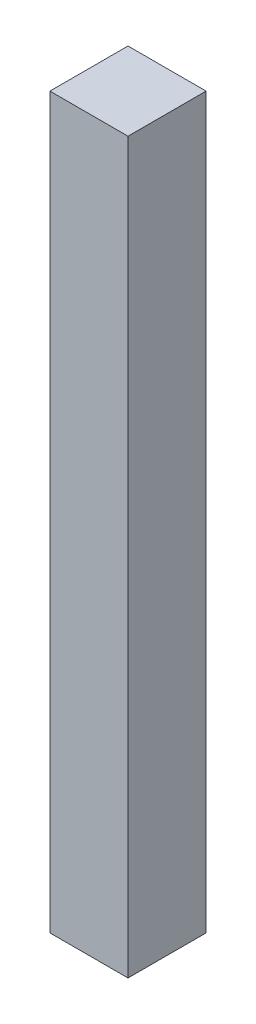
ISO-10303-21;
HEADER;
FILE_DESCRIPTION(('STEP AP214'),'2;1');
FILE_NAME('part.step','',(''),(''),'','','');
FILE_SCHEMA(('AUTOMOTIVE_DESIGN { 1 0 10303 214 1 1 1 1 }'));
ENDSEC;
DATA;
#1=APPLICATION_CONTEXT('core data for automotive mechanical design processes');
#2=APPLICATION_PROTOCOL_DEFINITION('international standard','automotive_design',2000,#1);
#3=PRODUCT_CONTEXT('',#1,'mechanical');
#4=PRODUCT('Part','Part','',(#3));
#5=PRODUCT_RELATED_PRODUCT_CATEGORY('part','',(#4));
#6=PRODUCT_DEFINITION_FORMATION('','',#4);
#7=PRODUCT_DEFINITION_CONTEXT('part definition',#1,'design');
#8=PRODUCT_DEFINITION('design','',#6,#7);
#9=PRODUCT_DEFINITION_SHAPE('','',#8);
#10=(LENGTH_UNIT() NAMED_UNIT(*) SI_UNIT(.MILLI.,.METRE.));
#11=(NAMED_UNIT(*) PLANE_ANGLE_UNIT() SI_UNIT($,.RADIAN.));
#12=(NAMED_UNIT(*) SI_UNIT($,.STERADIAN.) SOLID_ANGLE_UNIT());
#13=UNCERTAINTY_MEASURE_WITH_UNIT(LENGTH_MEASURE(1.E-05),#10,'distance_accuracy_value','');
#14=(GEOMETRIC_REPRESENTATION_CONTEXT(3) GLOBAL_UNCERTAINTY_ASSIGNED_CONTEXT((#13)) GLOBAL_UNIT_ASSIGNED_CONTEXT((#10,
#11,#12)) REPRESENTATION_CONTEXT('',''));
#15=CARTESIAN_POINT('',(0.,0.,0.));
#16=DIRECTION('',(0.,0.,1.));
#17=DIRECTION('',(1.,0.,0.));
#18=AXIS2_PLACEMENT_3D('',#15,#16,#17);
#19=CARTESIAN_POINT('',(15.,280.,15.));
#20=DIRECTION('',(-1.,0.,0.));
#21=DIRECTION('',(0.,0.,1.));
#22=AXIS2_PLACEMENT_3D('',#19,#20,#21);
#23=PLANE('',#22);
#24=DIRECTION('',(0.,0.,-1.));
#25=VECTOR('',#24,1.);
#26=CARTESIAN_POINT('',(15.,0.,15.));
#27=LINE('',#26,#25);
#28=CARTESIAN_POINT('',(15.,0.,15.));
#29=VERTEX_POINT('',#28);
#30=CARTESIAN_POINT('',(15.,0.,-15.));
#31=VERTEX_POINT('',#30);
#32=EDGE_CURVE('E104',#29,#31,#27,.T.);
#33=ORIENTED_EDGE('',*,*,#32,.T.);
#34=DIRECTION('',(0.,-1.,0.));
#35=VECTOR('',#34,1.);
#36=CARTESIAN_POINT('',(15.,280.,-15.));
#37=LINE('',#36,#35);
#38=CARTESIAN_POINT('',(15.,280.,-15.));
#39=VERTEX_POINT('',#38);
#40=EDGE_CURVE('E11',#39,#31,#37,.T.);
#41=ORIENTED_EDGE('',*,*,#40,.F.);
#42=DIRECTION('',(0.,0.,-1.));
#43=VECTOR('',#42,1.);
#44=CARTESIAN_POINT('',(15.,280.,15.));
#45=LINE('',#44,#43);
#46=CARTESIAN_POINT('',(15.,280.,15.));
#47=VERTEX_POINT('',#46);
#48=EDGE_CURVE('E92',#47,#39,#45,.T.);
#49=ORIENTED_EDGE('',*,*,#48,.F.);
#50=DIRECTION('',(0.,-1.,0.));
#51=VECTOR('',#50,1.);
#52=CARTESIAN_POINT('',(15.,280.,15.));
#53=LINE('',#52,#51);
#54=EDGE_CURVE('E100',#47,#29,#53,.T.);
#55=ORIENTED_EDGE('',*,*,#54,.T.);
#56=EDGE_LOOP('',(#33,#41,#49,#55));
#57=FACE_BOUND('',#56,.T.);
#58=ADVANCED_FACE('F41',(#57),#23,.F.);
#59=CARTESIAN_POINT('',(-15.,280.,-15.));
#60=DIRECTION('',(0.,0.,1.));
#61=DIRECTION('',(1.,0.,0.));
#62=AXIS2_PLACEMENT_3D('',#59,#60,#61);
#63=PLANE('',#62);
#64=DIRECTION('',(-1.,0.,0.));
#65=VECTOR('',#64,1.);
#66=CARTESIAN_POINT('',(-15.,0.,-15.));
#67=LINE('',#66,#65);
#68=CARTESIAN_POINT('',(-15.,0.,-15.));
#69=VERTEX_POINT('',#68);
#70=EDGE_CURVE('E96',#31,#69,#67,.T.);
#71=ORIENTED_EDGE('',*,*,#70,.T.);
#72=DIRECTION('',(0.,-1.,0.));
#73=VECTOR('',#72,1.);
#74=CARTESIAN_POINT('',(-15.,280.,-15.));
#75=LINE('',#74,#73);
#76=CARTESIAN_POINT('',(-15.,280.,-15.));
#77=VERTEX_POINT('',#76);
#78=EDGE_CURVE('E49',#77,#69,#75,.T.);
#79=ORIENTED_EDGE('',*,*,#78,.F.);
#80=DIRECTION('',(-1.,0.,0.));
#81=VECTOR('',#80,1.);
#82=CARTESIAN_POINT('',(-15.,280.,-15.));
#83=LINE('',#82,#81);
#84=EDGE_CURVE('E87',#39,#77,#83,.T.);
#85=ORIENTED_EDGE('',*,*,#84,.F.);
#86=ORIENTED_EDGE('',*,*,#40,.T.);
#87=EDGE_LOOP('',(#71,#79,#85,#86));
#88=FACE_BOUND('',#87,.T.);
#89=ADVANCED_FACE('F95',(#88),#63,.F.);
#90=CARTESIAN_POINT('',(-15.,280.,15.));
#91=DIRECTION('',(1.,0.,0.));
#92=DIRECTION('',(0.,0.,-1.));
#93=AXIS2_PLACEMENT_3D('',#90,#91,#92);
#94=PLANE('',#93);
#95=DIRECTION('',(0.,0.,1.));
#96=VECTOR('',#95,1.);
#97=CARTESIAN_POINT('',(-15.,0.,15.));
#98=LINE('',#97,#96);
#99=CARTESIAN_POINT('',(-15.,0.,15.));
#100=VERTEX_POINT('',#99);
#101=EDGE_CURVE('E74',#69,#100,#98,.T.);
#102=ORIENTED_EDGE('',*,*,#101,.T.);
#103=DIRECTION('',(0.,-1.,0.));
#104=VECTOR('',#103,1.);
#105=CARTESIAN_POINT('',(-15.,280.,15.));
#106=LINE('',#105,#104);
#107=CARTESIAN_POINT('',(-15.,280.,15.));
#108=VERTEX_POINT('',#107);
#109=EDGE_CURVE('E97',#108,#100,#106,.T.);
#110=ORIENTED_EDGE('',*,*,#109,.F.);
#111=DIRECTION('',(0.,0.,1.));
#112=VECTOR('',#111,1.);
#113=CARTESIAN_POINT('',(-15.,280.,15.));
#114=LINE('',#113,#112);
#115=EDGE_CURVE('E90',#77,#108,#114,.T.);
#116=ORIENTED_EDGE('',*,*,#115,.F.);
#117=ORIENTED_EDGE('',*,*,#78,.T.);
#118=EDGE_LOOP('',(#102,#110,#116,#117));
#119=FACE_BOUND('',#118,.T.);
#120=ADVANCED_FACE('F98',(#119),#94,.F.);
#121=CARTESIAN_POINT('',(-15.,280.,15.));
#122=DIRECTION('',(0.,0.,-1.));
#123=DIRECTION('',(-1.,0.,0.));
#124=AXIS2_PLACEMENT_3D('',#121,#122,#123);
#125=PLANE('',#124);
#126=DIRECTION('',(1.,0.,0.));
#127=VECTOR('',#126,1.);
#128=CARTESIAN_POINT('',(-15.,0.,15.));
#129=LINE('',#128,#127);
#130=EDGE_CURVE('E80',#100,#29,#129,.T.);
#131=ORIENTED_EDGE('',*,*,#130,.T.);
#132=ORIENTED_EDGE('',*,*,#54,.F.);
#133=DIRECTION('',(1.,0.,0.));
#134=VECTOR('',#133,1.);
#135=CARTESIAN_POINT('',(-15.,280.,15.));
#136=LINE('',#135,#134);
#137=EDGE_CURVE('E57',#108,#47,#136,.T.);
#138=ORIENTED_EDGE('',*,*,#137,.F.);
#139=ORIENTED_EDGE('',*,*,#109,.T.);
#140=EDGE_LOOP('',(#131,#132,#138,#139));
#141=FACE_BOUND('',#140,.T.);
#142=ADVANCED_FACE('F111',(#141),#125,.F.);
#143=CARTESIAN_POINT('',(0.,280.,0.));
#144=DIRECTION('',(0.,-1.,0.));
#145=DIRECTION('',(0.,0.,-1.));
#146=AXIS2_PLACEMENT_3D('',#143,#144,#145);
#147=PLANE('',#146);
#148=ORIENTED_EDGE('',*,*,#48,.T.);
#149=ORIENTED_EDGE('',*,*,#84,.T.);
#150=ORIENTED_EDGE('',*,*,#115,.T.);
#151=ORIENTED_EDGE('',*,*,#137,.T.);
#152=EDGE_LOOP('',(#148,#149,#150,#151));
#153=FACE_BOUND('',#152,.T.);
#154=ADVANCED_FACE('F88',(#153),#147,.F.);
#155=CARTESIAN_POINT('',(0.,0.,0.));
#156=DIRECTION('',(0.,-1.,0.));
#157=DIRECTION('',(0.,0.,-1.));
#158=AXIS2_PLACEMENT_3D('',#155,#156,#157);
#159=PLANE('',#158);
#160=ORIENTED_EDGE('',*,*,#32,.F.);
#161=ORIENTED_EDGE('',*,*,#130,.F.);
#162=ORIENTED_EDGE('',*,*,#101,.F.);
#163=ORIENTED_EDGE('',*,*,#70,.F.);
#164=EDGE_LOOP('',(#160,#161,#162,#163));
#165=FACE_BOUND('',#164,.T.);
#166=ADVANCED_FACE('F114',(#165),#159,.T.);
#167=CLOSED_SHELL('',(#58,#89,#120,#142,#154,#166));
#168=MANIFOLD_SOLID_BREP('B2',#167);
#169=ADVANCED_BREP_SHAPE_REPRESENTATION('',(#18,#168),#14);
#170=SHAPE_DEFINITION_REPRESENTATION(#9,#169);
ENDSEC;
END-ISO-10303-21;
